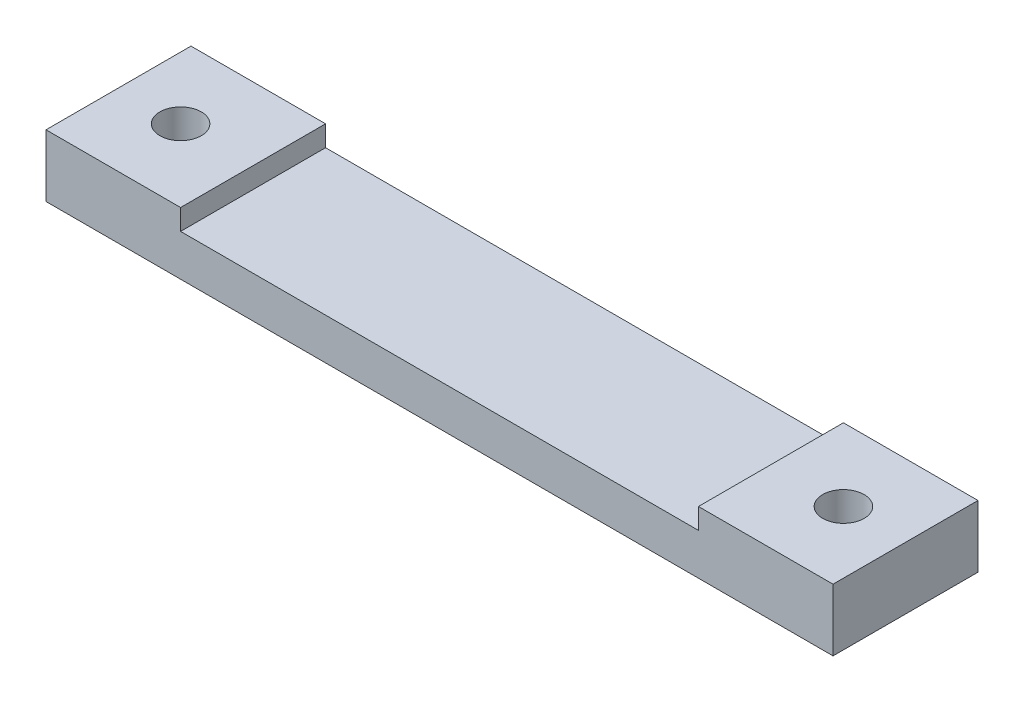
ISO-10303-21;
HEADER;
FILE_DESCRIPTION(('STEP AP214'),'2;1');
FILE_NAME('part.step','',(''),(''),'','','');
FILE_SCHEMA(('AUTOMOTIVE_DESIGN { 1 0 10303 214 1 1 1 1 }'));
ENDSEC;
DATA;
#1=APPLICATION_CONTEXT('core data for automotive mechanical design processes');
#2=APPLICATION_PROTOCOL_DEFINITION('international standard','automotive_design',2000,#1);
#3=PRODUCT_CONTEXT('',#1,'mechanical');
#4=PRODUCT('Part','Part','',(#3));
#5=PRODUCT_RELATED_PRODUCT_CATEGORY('part','',(#4));
#6=PRODUCT_DEFINITION_FORMATION('','',#4);
#7=PRODUCT_DEFINITION_CONTEXT('part definition',#1,'design');
#8=PRODUCT_DEFINITION('design','',#6,#7);
#9=PRODUCT_DEFINITION_SHAPE('','',#8);
#10=(LENGTH_UNIT() NAMED_UNIT(*) SI_UNIT(.MILLI.,.METRE.));
#11=(NAMED_UNIT(*) PLANE_ANGLE_UNIT() SI_UNIT($,.RADIAN.));
#12=(NAMED_UNIT(*) SI_UNIT($,.STERADIAN.) SOLID_ANGLE_UNIT());
#13=UNCERTAINTY_MEASURE_WITH_UNIT(LENGTH_MEASURE(1.E-05),#10,'distance_accuracy_value','');
#14=(GEOMETRIC_REPRESENTATION_CONTEXT(3) GLOBAL_UNCERTAINTY_ASSIGNED_CONTEXT((#13)) GLOBAL_UNIT_ASSIGNED_CONTEXT((#10,
#11,#12)) REPRESENTATION_CONTEXT('',''));
#15=CARTESIAN_POINT('',(0.,0.,0.));
#16=DIRECTION('',(0.,0.,1.));
#17=DIRECTION('',(1.,0.,0.));
#18=AXIS2_PLACEMENT_3D('',#15,#16,#17);
#19=CARTESIAN_POINT('',(0.,2.,0.));
#20=DIRECTION('',(0.,1.,0.));
#21=DIRECTION('',(0.,0.,1.));
#22=AXIS2_PLACEMENT_3D('',#19,#20,#21);
#23=PLANE('',#22);
#24=DIRECTION('',(1.,0.,0.));
#25=VECTOR('',#24,1.);
#26=CARTESIAN_POINT('',(-19.,2.,3.5));
#27=LINE('',#26,#25);
#28=CARTESIAN_POINT('',(-12.5012865960758,2.,3.5));
#29=VERTEX_POINT('',#28);
#30=CARTESIAN_POINT('',(12.5022274096244,2.,3.5));
#31=VERTEX_POINT('',#30);
#32=EDGE_CURVE('E55',#29,#31,#27,.T.);
#33=ORIENTED_EDGE('',*,*,#32,.T.);
#34=DIRECTION('',(0.,0.,1.));
#35=VECTOR('',#34,1.);
#36=CARTESIAN_POINT('',(12.5022274096244,2.,-3.5));
#37=LINE('',#36,#35);
#38=CARTESIAN_POINT('',(12.5022274096244,2.,-3.5));
#39=VERTEX_POINT('',#38);
#40=EDGE_CURVE('E50',#39,#31,#37,.T.);
#41=ORIENTED_EDGE('',*,*,#40,.F.);
#42=DIRECTION('',(-1.,0.,0.));
#43=VECTOR('',#42,1.);
#44=CARTESIAN_POINT('',(-19.,2.,-3.5));
#45=LINE('',#44,#43);
#46=CARTESIAN_POINT('',(-12.5012865960758,2.,-3.5));
#47=VERTEX_POINT('',#46);
#48=EDGE_CURVE('E157',#39,#47,#45,.T.);
#49=ORIENTED_EDGE('',*,*,#48,.T.);
#50=DIRECTION('',(0.,0.,-1.));
#51=VECTOR('',#50,1.);
#52=CARTESIAN_POINT('',(-12.5012865960758,2.,-3.5));
#53=LINE('',#52,#51);
#54=EDGE_CURVE('E136',#29,#47,#53,.T.);
#55=ORIENTED_EDGE('',*,*,#54,.F.);
#56=EDGE_LOOP('',(#33,#41,#49,#55));
#57=FACE_BOUND('',#56,.T.);
#58=ADVANCED_FACE('F35',(#57),#23,.T.);
#59=CARTESIAN_POINT('',(-19.,2.,-3.5));
#60=DIRECTION('',(1.,0.,0.));
#61=DIRECTION('',(0.,0.,-1.));
#62=AXIS2_PLACEMENT_3D('',#59,#60,#61);
#63=PLANE('',#62);
#64=DIRECTION('',(0.,0.,1.));
#65=VECTOR('',#64,1.);
#66=CARTESIAN_POINT('',(-19.,0.,-3.5));
#67=LINE('',#66,#65);
#68=CARTESIAN_POINT('',(-19.,0.,-3.5));
#69=VERTEX_POINT('',#68);
#70=CARTESIAN_POINT('',(-19.,0.,3.5));
#71=VERTEX_POINT('',#70);
#72=EDGE_CURVE('E155',#69,#71,#67,.T.);
#73=ORIENTED_EDGE('',*,*,#72,.T.);
#74=DIRECTION('',(0.,-1.,0.));
#75=VECTOR('',#74,1.);
#76=CARTESIAN_POINT('',(-19.,2.,3.5));
#77=LINE('',#76,#75);
#78=CARTESIAN_POINT('',(-19.,3.,3.5));
#79=VERTEX_POINT('',#78);
#80=EDGE_CURVE('E11',#79,#71,#77,.T.);
#81=ORIENTED_EDGE('',*,*,#80,.F.);
#82=DIRECTION('',(0.,0.,1.));
#83=VECTOR('',#82,1.);
#84=CARTESIAN_POINT('',(-19.,3.,-3.5));
#85=LINE('',#84,#83);
#86=CARTESIAN_POINT('',(-19.,3.,-3.5));
#87=VERTEX_POINT('',#86);
#88=EDGE_CURVE('E137',#87,#79,#85,.T.);
#89=ORIENTED_EDGE('',*,*,#88,.F.);
#90=DIRECTION('',(0.,-1.,0.));
#91=VECTOR('',#90,1.);
#92=CARTESIAN_POINT('',(-19.,2.,-3.5));
#93=LINE('',#92,#91);
#94=EDGE_CURVE('E108',#87,#69,#93,.T.);
#95=ORIENTED_EDGE('',*,*,#94,.T.);
#96=EDGE_LOOP('',(#73,#81,#89,#95));
#97=FACE_BOUND('',#96,.T.);
#98=ADVANCED_FACE('F37',(#97),#63,.F.);
#99=CARTESIAN_POINT('',(-19.,2.,3.5));
#100=DIRECTION('',(0.,0.,-1.));
#101=DIRECTION('',(-1.,0.,0.));
#102=AXIS2_PLACEMENT_3D('',#99,#100,#101);
#103=PLANE('',#102);
#104=DIRECTION('',(1.,0.,0.));
#105=VECTOR('',#104,1.);
#106=CARTESIAN_POINT('',(-19.,0.,3.5));
#107=LINE('',#106,#105);
#108=CARTESIAN_POINT('',(19.,0.,3.5));
#109=VERTEX_POINT('',#108);
#110=EDGE_CURVE('E162',#71,#109,#107,.T.);
#111=ORIENTED_EDGE('',*,*,#110,.T.);
#112=DIRECTION('',(0.,-1.,0.));
#113=VECTOR('',#112,1.);
#114=CARTESIAN_POINT('',(19.,2.,3.5));
#115=LINE('',#114,#113);
#116=CARTESIAN_POINT('',(19.,3.,3.5));
#117=VERTEX_POINT('',#116);
#118=EDGE_CURVE('E43',#117,#109,#115,.T.);
#119=ORIENTED_EDGE('',*,*,#118,.F.);
#120=DIRECTION('',(1.,0.,0.));
#121=VECTOR('',#120,1.);
#122=CARTESIAN_POINT('',(19.,3.,3.5));
#123=LINE('',#122,#121);
#124=CARTESIAN_POINT('',(12.5022274096244,3.,3.5));
#125=VERTEX_POINT('',#124);
#126=EDGE_CURVE('E122',#125,#117,#123,.T.);
#127=ORIENTED_EDGE('',*,*,#126,.F.);
#128=DIRECTION('',(0.,-1.,0.));
#129=VECTOR('',#128,1.);
#130=CARTESIAN_POINT('',(12.5022274096244,3.,3.5));
#131=LINE('',#130,#129);
#132=EDGE_CURVE('E131',#125,#31,#131,.T.);
#133=ORIENTED_EDGE('',*,*,#132,.T.);
#134=ORIENTED_EDGE('',*,*,#32,.F.);
#135=DIRECTION('',(0.,-1.,0.));
#136=VECTOR('',#135,1.);
#137=CARTESIAN_POINT('',(-12.5012865960758,3.,3.5));
#138=LINE('',#137,#136);
#139=CARTESIAN_POINT('',(-12.5012865960758,3.,3.5));
#140=VERTEX_POINT('',#139);
#141=EDGE_CURVE('E152',#140,#29,#138,.T.);
#142=ORIENTED_EDGE('',*,*,#141,.F.);
#143=DIRECTION('',(1.,0.,0.));
#144=VECTOR('',#143,1.);
#145=CARTESIAN_POINT('',(-19.,3.,3.5));
#146=LINE('',#145,#144);
#147=EDGE_CURVE('E140',#79,#140,#146,.T.);
#148=ORIENTED_EDGE('',*,*,#147,.F.);
#149=ORIENTED_EDGE('',*,*,#80,.T.);
#150=EDGE_LOOP('',(#111,#119,#127,#133,#134,#142,#148,#149));
#151=FACE_BOUND('',#150,.T.);
#152=ADVANCED_FACE('F182',(#151),#103,.F.);
#153=CARTESIAN_POINT('',(19.,2.,-3.5));
#154=DIRECTION('',(-1.,0.,0.));
#155=DIRECTION('',(0.,0.,1.));
#156=AXIS2_PLACEMENT_3D('',#153,#154,#155);
#157=PLANE('',#156);
#158=DIRECTION('',(0.,0.,-1.));
#159=VECTOR('',#158,1.);
#160=CARTESIAN_POINT('',(19.,0.,-3.5));
#161=LINE('',#160,#159);
#162=CARTESIAN_POINT('',(19.,0.,-3.5));
#163=VERTEX_POINT('',#162);
#164=EDGE_CURVE('E105',#109,#163,#161,.T.);
#165=ORIENTED_EDGE('',*,*,#164,.T.);
#166=DIRECTION('',(0.,-1.,0.));
#167=VECTOR('',#166,1.);
#168=CARTESIAN_POINT('',(19.,2.,-3.5));
#169=LINE('',#168,#167);
#170=CARTESIAN_POINT('',(19.,3.,-3.5));
#171=VERTEX_POINT('',#170);
#172=EDGE_CURVE('E98',#171,#163,#169,.T.);
#173=ORIENTED_EDGE('',*,*,#172,.F.);
#174=DIRECTION('',(0.,0.,-1.));
#175=VECTOR('',#174,1.);
#176=CARTESIAN_POINT('',(19.,3.,-3.5));
#177=LINE('',#176,#175);
#178=EDGE_CURVE('E103',#117,#171,#177,.T.);
#179=ORIENTED_EDGE('',*,*,#178,.F.);
#180=ORIENTED_EDGE('',*,*,#118,.T.);
#181=EDGE_LOOP('',(#165,#173,#179,#180));
#182=FACE_BOUND('',#181,.T.);
#183=ADVANCED_FACE('F100',(#182),#157,.F.);
#184=CARTESIAN_POINT('',(-19.,2.,-3.5));
#185=DIRECTION('',(0.,0.,1.));
#186=DIRECTION('',(1.,0.,0.));
#187=AXIS2_PLACEMENT_3D('',#184,#185,#186);
#188=PLANE('',#187);
#189=DIRECTION('',(-1.,0.,0.));
#190=VECTOR('',#189,1.);
#191=CARTESIAN_POINT('',(-19.,0.,-3.5));
#192=LINE('',#191,#190);
#193=EDGE_CURVE('E158',#163,#69,#192,.T.);
#194=ORIENTED_EDGE('',*,*,#193,.T.);
#195=ORIENTED_EDGE('',*,*,#94,.F.);
#196=DIRECTION('',(-1.,0.,0.));
#197=VECTOR('',#196,1.);
#198=CARTESIAN_POINT('',(-19.,3.,-3.5));
#199=LINE('',#198,#197);
#200=CARTESIAN_POINT('',(-12.5012865960758,3.,-3.5));
#201=VERTEX_POINT('',#200);
#202=EDGE_CURVE('E144',#201,#87,#199,.T.);
#203=ORIENTED_EDGE('',*,*,#202,.F.);
#204=DIRECTION('',(0.,-1.,0.));
#205=VECTOR('',#204,1.);
#206=CARTESIAN_POINT('',(-12.5012865960758,3.,-3.5));
#207=LINE('',#206,#205);
#208=EDGE_CURVE('E147',#201,#47,#207,.T.);
#209=ORIENTED_EDGE('',*,*,#208,.T.);
#210=ORIENTED_EDGE('',*,*,#48,.F.);
#211=DIRECTION('',(0.,-1.,0.));
#212=VECTOR('',#211,1.);
#213=CARTESIAN_POINT('',(12.5022274096244,3.,-3.5));
#214=LINE('',#213,#212);
#215=CARTESIAN_POINT('',(12.5022274096244,3.,-3.5));
#216=VERTEX_POINT('',#215);
#217=EDGE_CURVE('E114',#216,#39,#214,.T.);
#218=ORIENTED_EDGE('',*,*,#217,.F.);
#219=DIRECTION('',(-1.,0.,0.));
#220=VECTOR('',#219,1.);
#221=CARTESIAN_POINT('',(19.,3.,-3.5));
#222=LINE('',#221,#220);
#223=EDGE_CURVE('E111',#171,#216,#222,.T.);
#224=ORIENTED_EDGE('',*,*,#223,.F.);
#225=ORIENTED_EDGE('',*,*,#172,.T.);
#226=EDGE_LOOP('',(#194,#195,#203,#209,#210,#218,#224,#225));
#227=FACE_BOUND('',#226,.T.);
#228=ADVANCED_FACE('F112',(#227),#188,.F.);
#229=CARTESIAN_POINT('',(0.,0.,0.));
#230=DIRECTION('',(0.,1.,0.));
#231=DIRECTION('',(0.,0.,1.));
#232=AXIS2_PLACEMENT_3D('',#229,#230,#231);
#233=PLANE('',#232);
#234=CARTESIAN_POINT('',(-16.0012865960758,0.,0.));
#235=DIRECTION('',(0.,1.,0.));
#236=DIRECTION('',(0.,0.,1.));
#237=AXIS2_PLACEMENT_3D('',#234,#235,#236);
#238=CIRCLE('',#237,1.);
#239=CARTESIAN_POINT('',(-16.0012865960758,0.,1.));
#240=VERTEX_POINT('',#239);
#241=EDGE_CURVE('E124',#240,#240,#238,.T.);
#242=ORIENTED_EDGE('',*,*,#241,.T.);
#243=EDGE_LOOP('',(#242));
#244=FACE_BOUND('',#243,.T.);
#245=CARTESIAN_POINT('',(16.0022274096244,0.,0.));
#246=DIRECTION('',(0.,1.,0.));
#247=DIRECTION('',(0.,0.,1.));
#248=AXIS2_PLACEMENT_3D('',#245,#246,#247);
#249=CIRCLE('',#248,1.);
#250=CARTESIAN_POINT('',(16.0022274096244,0.,1.));
#251=VERTEX_POINT('',#250);
#252=EDGE_CURVE('E272',#251,#251,#249,.T.);
#253=ORIENTED_EDGE('',*,*,#252,.T.);
#254=EDGE_LOOP('',(#253));
#255=FACE_BOUND('',#254,.T.);
#256=ORIENTED_EDGE('',*,*,#72,.F.);
#257=ORIENTED_EDGE('',*,*,#193,.F.);
#258=ORIENTED_EDGE('',*,*,#164,.F.);
#259=ORIENTED_EDGE('',*,*,#110,.F.);
#260=EDGE_LOOP('',(#256,#257,#258,#259));
#261=FACE_BOUND('',#260,.T.);
#262=ADVANCED_FACE('F170',(#244,#255,#261),#233,.F.);
#263=CARTESIAN_POINT('',(-12.5012865960758,3.,-3.5));
#264=DIRECTION('',(-1.,0.,0.));
#265=DIRECTION('',(0.,0.,1.));
#266=AXIS2_PLACEMENT_3D('',#263,#264,#265);
#267=PLANE('',#266);
#268=ORIENTED_EDGE('',*,*,#54,.T.);
#269=ORIENTED_EDGE('',*,*,#208,.F.);
#270=DIRECTION('',(0.,0.,-1.));
#271=VECTOR('',#270,1.);
#272=CARTESIAN_POINT('',(-12.5012865960758,3.,-3.5));
#273=LINE('',#272,#271);
#274=EDGE_CURVE('E142',#140,#201,#273,.T.);
#275=ORIENTED_EDGE('',*,*,#274,.F.);
#276=ORIENTED_EDGE('',*,*,#141,.T.);
#277=EDGE_LOOP('',(#268,#269,#275,#276));
#278=FACE_BOUND('',#277,.T.);
#279=ADVANCED_FACE('F181',(#278),#267,.F.);
#280=CARTESIAN_POINT('',(0.,3.,0.));
#281=DIRECTION('',(0.,1.,0.));
#282=DIRECTION('',(0.,0.,1.));
#283=AXIS2_PLACEMENT_3D('',#280,#281,#282);
#284=PLANE('',#283);
#285=CARTESIAN_POINT('',(-16.0012865960758,3.,0.));
#286=DIRECTION('',(0.,1.,0.));
#287=DIRECTION('',(0.,0.,1.));
#288=AXIS2_PLACEMENT_3D('',#285,#286,#287);
#289=CIRCLE('',#288,1.);
#290=CARTESIAN_POINT('',(-16.0012865960758,3.,1.));
#291=VERTEX_POINT('',#290);
#292=EDGE_CURVE('E271',#291,#291,#289,.T.);
#293=ORIENTED_EDGE('',*,*,#292,.F.);
#294=EDGE_LOOP('',(#293));
#295=FACE_BOUND('',#294,.T.);
#296=ORIENTED_EDGE('',*,*,#88,.T.);
#297=ORIENTED_EDGE('',*,*,#147,.T.);
#298=ORIENTED_EDGE('',*,*,#274,.T.);
#299=ORIENTED_EDGE('',*,*,#202,.T.);
#300=EDGE_LOOP('',(#296,#297,#298,#299));
#301=FACE_BOUND('',#300,.T.);
#302=ADVANCED_FACE('F176',(#295,#301),#284,.T.);
#303=CARTESIAN_POINT('',(12.5022274096244,3.,-3.5));
#304=DIRECTION('',(1.,0.,0.));
#305=DIRECTION('',(0.,0.,-1.));
#306=AXIS2_PLACEMENT_3D('',#303,#304,#305);
#307=PLANE('',#306);
#308=ORIENTED_EDGE('',*,*,#40,.T.);
#309=ORIENTED_EDGE('',*,*,#132,.F.);
#310=DIRECTION('',(0.,0.,1.));
#311=VECTOR('',#310,1.);
#312=CARTESIAN_POINT('',(12.5022274096244,3.,-3.5));
#313=LINE('',#312,#311);
#314=EDGE_CURVE('E117',#216,#125,#313,.T.);
#315=ORIENTED_EDGE('',*,*,#314,.F.);
#316=ORIENTED_EDGE('',*,*,#217,.T.);
#317=EDGE_LOOP('',(#308,#309,#315,#316));
#318=FACE_BOUND('',#317,.T.);
#319=ADVANCED_FACE('F185',(#318),#307,.F.);
#320=CARTESIAN_POINT('',(0.,3.,0.));
#321=DIRECTION('',(0.,-1.,0.));
#322=DIRECTION('',(0.,0.,-1.));
#323=AXIS2_PLACEMENT_3D('',#320,#321,#322);
#324=PLANE('',#323);
#325=CARTESIAN_POINT('',(16.0022274096244,3.,0.));
#326=DIRECTION('',(0.,1.,0.));
#327=DIRECTION('',(0.,0.,1.));
#328=AXIS2_PLACEMENT_3D('',#325,#326,#327);
#329=CIRCLE('',#328,1.);
#330=CARTESIAN_POINT('',(16.0022274096244,3.,1.));
#331=VERTEX_POINT('',#330);
#332=EDGE_CURVE('E127',#331,#331,#329,.T.);
#333=ORIENTED_EDGE('',*,*,#332,.F.);
#334=EDGE_LOOP('',(#333));
#335=FACE_BOUND('',#334,.T.);
#336=ORIENTED_EDGE('',*,*,#178,.T.);
#337=ORIENTED_EDGE('',*,*,#223,.T.);
#338=ORIENTED_EDGE('',*,*,#314,.T.);
#339=ORIENTED_EDGE('',*,*,#126,.T.);
#340=EDGE_LOOP('',(#336,#337,#338,#339));
#341=FACE_BOUND('',#340,.T.);
#342=ADVANCED_FACE('F120',(#335,#341),#324,.F.);
#343=CARTESIAN_POINT('',(16.0022274096244,0.,0.));
#344=DIRECTION('',(0.,1.,0.));
#345=DIRECTION('',(0.,0.,1.));
#346=AXIS2_PLACEMENT_3D('',#343,#344,#345);
#347=CYLINDRICAL_SURFACE('',#346,1.);
#348=ORIENTED_EDGE('',*,*,#252,.F.);
#349=EDGE_LOOP('',(#348));
#350=FACE_BOUND('',#349,.T.);
#351=ORIENTED_EDGE('',*,*,#332,.T.);
#352=EDGE_LOOP('',(#351));
#353=FACE_BOUND('',#352,.T.);
#354=ADVANCED_FACE('F192',(#350,#353),#347,.F.);
#355=CARTESIAN_POINT('',(-16.0012865960758,0.,0.));
#356=DIRECTION('',(0.,1.,0.));
#357=DIRECTION('',(0.,0.,1.));
#358=AXIS2_PLACEMENT_3D('',#355,#356,#357);
#359=CYLINDRICAL_SURFACE('',#358,1.);
#360=ORIENTED_EDGE('',*,*,#241,.F.);
#361=EDGE_LOOP('',(#360));
#362=FACE_BOUND('',#361,.T.);
#363=ORIENTED_EDGE('',*,*,#292,.T.);
#364=EDGE_LOOP('',(#363));
#365=FACE_BOUND('',#364,.T.);
#366=ADVANCED_FACE('F252',(#362,#365),#359,.F.);
#367=CLOSED_SHELL('',(#58,#98,#152,#183,#228,#262,#279,#302,#319,#342,#354,#366));
#368=MANIFOLD_SOLID_BREP('B2',#367);
#369=ADVANCED_BREP_SHAPE_REPRESENTATION('',(#18,#368),#14);
#370=SHAPE_DEFINITION_REPRESENTATION(#9,#369);
ENDSEC;
END-ISO-10303-21;
